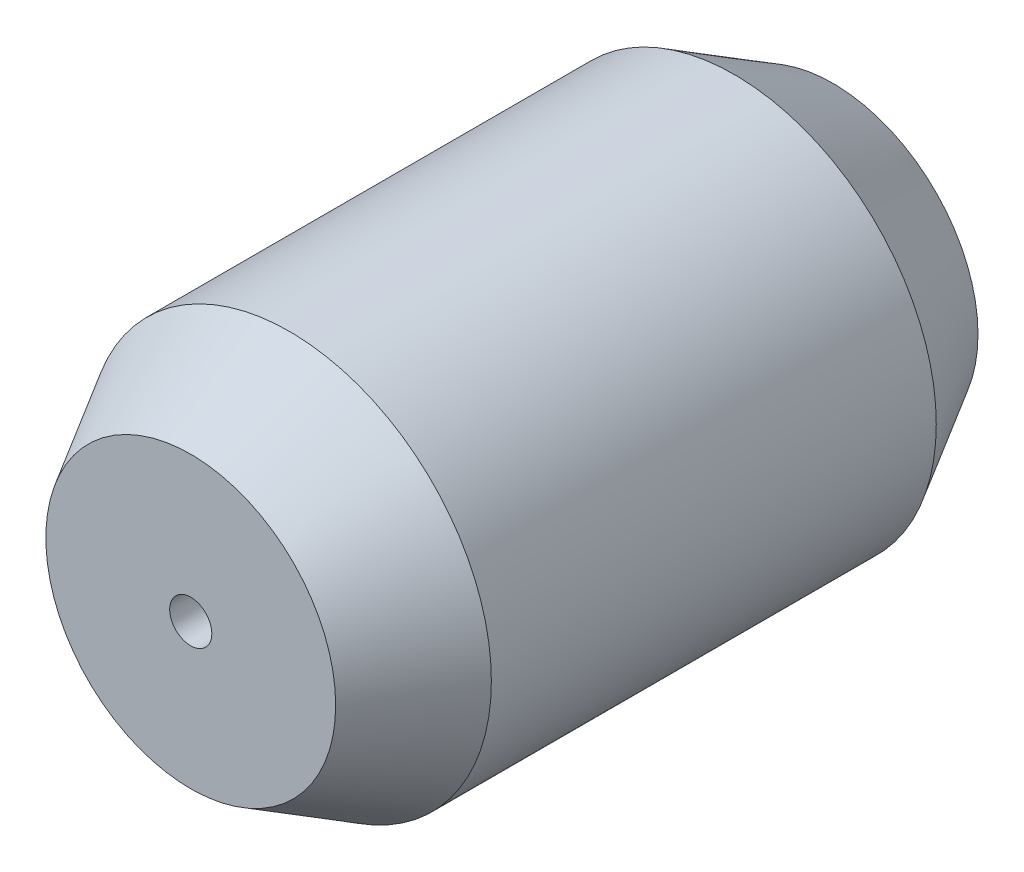
ISO-10303-21;
HEADER;
FILE_DESCRIPTION(('STEP AP214'),'2;1');
FILE_NAME('part.step','',(''),(''),'','','');
FILE_SCHEMA(('AUTOMOTIVE_DESIGN { 1 0 10303 214 1 1 1 1 }'));
ENDSEC;
DATA;
#1=APPLICATION_CONTEXT('core data for automotive mechanical design processes');
#2=APPLICATION_PROTOCOL_DEFINITION('international standard','automotive_design',2000,#1);
#3=PRODUCT_CONTEXT('',#1,'mechanical');
#4=PRODUCT('Part','Part','',(#3));
#5=PRODUCT_RELATED_PRODUCT_CATEGORY('part','',(#4));
#6=PRODUCT_DEFINITION_FORMATION('','',#4);
#7=PRODUCT_DEFINITION_CONTEXT('part definition',#1,'design');
#8=PRODUCT_DEFINITION('design','',#6,#7);
#9=PRODUCT_DEFINITION_SHAPE('','',#8);
#10=(LENGTH_UNIT() NAMED_UNIT(*) SI_UNIT(.MILLI.,.METRE.));
#11=(NAMED_UNIT(*) PLANE_ANGLE_UNIT() SI_UNIT($,.RADIAN.));
#12=(NAMED_UNIT(*) SI_UNIT($,.STERADIAN.) SOLID_ANGLE_UNIT());
#13=UNCERTAINTY_MEASURE_WITH_UNIT(LENGTH_MEASURE(1.E-05),#10,'distance_accuracy_value','');
#14=(GEOMETRIC_REPRESENTATION_CONTEXT(3) GLOBAL_UNCERTAINTY_ASSIGNED_CONTEXT((#13)) GLOBAL_UNIT_ASSIGNED_CONTEXT((#10,
#11,#12)) REPRESENTATION_CONTEXT('',''));
#15=CARTESIAN_POINT('',(0.,0.,0.));
#16=DIRECTION('',(0.,0.,1.));
#17=DIRECTION('',(1.,0.,0.));
#18=AXIS2_PLACEMENT_3D('',#15,#16,#17);
#19=CARTESIAN_POINT('',(0.,0.,-15.494));
#20=DIRECTION('',(0.,0.,1.));
#21=DIRECTION('',(1.,0.,0.));
#22=AXIS2_PLACEMENT_3D('',#19,#20,#21);
#23=CYLINDRICAL_SURFACE('',#22,9.7409);
#24=CARTESIAN_POINT('',(0.,0.,10.7315));
#25=DIRECTION('',(0.,0.,1.));
#26=DIRECTION('',(1.,0.,0.));
#27=AXIS2_PLACEMENT_3D('',#24,#25,#26);
#28=CIRCLE('',#27,9.7409);
#29=CARTESIAN_POINT('',(9.7409,0.,10.7315));
#30=VERTEX_POINT('',#29);
#31=EDGE_CURVE('E10',#30,#30,#28,.F.);
#32=ORIENTED_EDGE('',*,*,#31,.T.);
#33=EDGE_LOOP('',(#32));
#34=FACE_BOUND('',#33,.T.);
#35=CARTESIAN_POINT('',(0.,0.,-10.7315));
#36=DIRECTION('',(0.,0.,1.));
#37=DIRECTION('',(1.,0.,0.));
#38=AXIS2_PLACEMENT_3D('',#35,#36,#37);
#39=CIRCLE('',#38,9.7409);
#40=CARTESIAN_POINT('',(9.7409,0.,-10.7315));
#41=VERTEX_POINT('',#40);
#42=EDGE_CURVE('E62',#41,#41,#39,.T.);
#43=ORIENTED_EDGE('',*,*,#42,.T.);
#44=EDGE_LOOP('',(#43));
#45=FACE_BOUND('',#44,.T.);
#46=ADVANCED_FACE('F43',(#34,#45),#23,.T.);
#47=CARTESIAN_POINT('',(0.,0.,-15.494));
#48=DIRECTION('',(0.,0.,1.));
#49=DIRECTION('',(1.,0.,0.));
#50=AXIS2_PLACEMENT_3D('',#47,#48,#49);
#51=PLANE('',#50);
#52=CARTESIAN_POINT('',(0.,0.,-15.494));
#53=DIRECTION('',(0.,0.,1.));
#54=DIRECTION('',(1.,0.,0.));
#55=AXIS2_PLACEMENT_3D('',#52,#53,#54);
#56=CIRCLE('',#55,6.9912693429844);
#57=CARTESIAN_POINT('',(6.9912693429844,0.,-15.494));
#58=VERTEX_POINT('',#57);
#59=EDGE_CURVE('E57',#58,#58,#56,.F.);
#60=ORIENTED_EDGE('',*,*,#59,.T.);
#61=EDGE_LOOP('',(#60));
#62=FACE_BOUND('',#61,.T.);
#63=CARTESIAN_POINT('',(0.,0.,-15.494));
#64=DIRECTION('',(0.,0.,1.));
#65=DIRECTION('',(1.,0.,0.));
#66=AXIS2_PLACEMENT_3D('',#63,#64,#65);
#67=CIRCLE('',#66,1.016);
#68=CARTESIAN_POINT('',(1.016,0.,-15.494));
#69=VERTEX_POINT('',#68);
#70=EDGE_CURVE('E68',#69,#69,#67,.T.);
#71=ORIENTED_EDGE('',*,*,#70,.T.);
#72=EDGE_LOOP('',(#71));
#73=FACE_BOUND('',#72,.T.);
#74=ADVANCED_FACE('F90',(#62,#73),#51,.F.);
#75=CARTESIAN_POINT('',(0.,0.,-15.494));
#76=DIRECTION('',(0.,0.,1.));
#77=DIRECTION('',(1.,0.,0.));
#78=AXIS2_PLACEMENT_3D('',#75,#76,#77);
#79=CYLINDRICAL_SURFACE('',#78,1.016);
#80=ORIENTED_EDGE('',*,*,#70,.F.);
#81=EDGE_LOOP('',(#80));
#82=FACE_BOUND('',#81,.T.);
#83=CARTESIAN_POINT('',(0.,0.,15.494));
#84=DIRECTION('',(0.,0.,1.));
#85=DIRECTION('',(1.,0.,0.));
#86=AXIS2_PLACEMENT_3D('',#83,#84,#85);
#87=CIRCLE('',#86,1.016);
#88=CARTESIAN_POINT('',(1.016,0.,15.494));
#89=VERTEX_POINT('',#88);
#90=EDGE_CURVE('E72',#89,#89,#87,.T.);
#91=ORIENTED_EDGE('',*,*,#90,.T.);
#92=EDGE_LOOP('',(#91));
#93=FACE_BOUND('',#92,.T.);
#94=ADVANCED_FACE('F77',(#82,#93),#79,.F.);
#95=CARTESIAN_POINT('',(0.,0.,15.494));
#96=DIRECTION('',(0.,0.,1.));
#97=DIRECTION('',(1.,0.,0.));
#98=AXIS2_PLACEMENT_3D('',#95,#96,#97);
#99=PLANE('',#98);
#100=CARTESIAN_POINT('',(0.,0.,15.494));
#101=DIRECTION('',(0.,0.,1.));
#102=DIRECTION('',(1.,0.,0.));
#103=AXIS2_PLACEMENT_3D('',#100,#101,#102);
#104=CIRCLE('',#103,6.99126934298441);
#105=CARTESIAN_POINT('',(6.99126934298441,0.,15.494));
#106=VERTEX_POINT('',#105);
#107=EDGE_CURVE('E52',#106,#106,#104,.T.);
#108=ORIENTED_EDGE('',*,*,#107,.T.);
#109=EDGE_LOOP('',(#108));
#110=FACE_BOUND('',#109,.T.);
#111=ORIENTED_EDGE('',*,*,#90,.F.);
#112=EDGE_LOOP('',(#111));
#113=FACE_BOUND('',#112,.T.);
#114=ADVANCED_FACE('F79',(#110,#113),#99,.T.);
#115=CARTESIAN_POINT('',(0.,0.,-10.7315));
#116=DIRECTION('',(0.,0.,1.));
#117=DIRECTION('',(1.,0.,0.));
#118=AXIS2_PLACEMENT_3D('',#115,#116,#117);
#119=CONICAL_SURFACE('',#118,9.7409,0.523598775598296);
#120=ORIENTED_EDGE('',*,*,#59,.F.);
#121=EDGE_LOOP('',(#120));
#122=FACE_BOUND('',#121,.T.);
#123=ORIENTED_EDGE('',*,*,#42,.F.);
#124=EDGE_LOOP('',(#123));
#125=FACE_BOUND('',#124,.T.);
#126=ADVANCED_FACE('F81',(#122,#125),#119,.T.);
#127=CARTESIAN_POINT('',(0.,0.,15.494));
#128=DIRECTION('',(0.,0.,-1.));
#129=DIRECTION('',(-1.,0.,0.));
#130=AXIS2_PLACEMENT_3D('',#127,#128,#129);
#131=CONICAL_SURFACE('',#130,6.99126934298441,0.523598775598296);
#132=ORIENTED_EDGE('',*,*,#31,.F.);
#133=EDGE_LOOP('',(#132));
#134=FACE_BOUND('',#133,.T.);
#135=ORIENTED_EDGE('',*,*,#107,.F.);
#136=EDGE_LOOP('',(#135));
#137=FACE_BOUND('',#136,.T.);
#138=ADVANCED_FACE('F46',(#134,#137),#131,.T.);
#139=CLOSED_SHELL('',(#46,#74,#94,#114,#126,#138));
#140=MANIFOLD_SOLID_BREP('B2',#139);
#141=ADVANCED_BREP_SHAPE_REPRESENTATION('',(#18,#140),#14);
#142=SHAPE_DEFINITION_REPRESENTATION(#9,#141);
ENDSEC;
END-ISO-10303-21;
